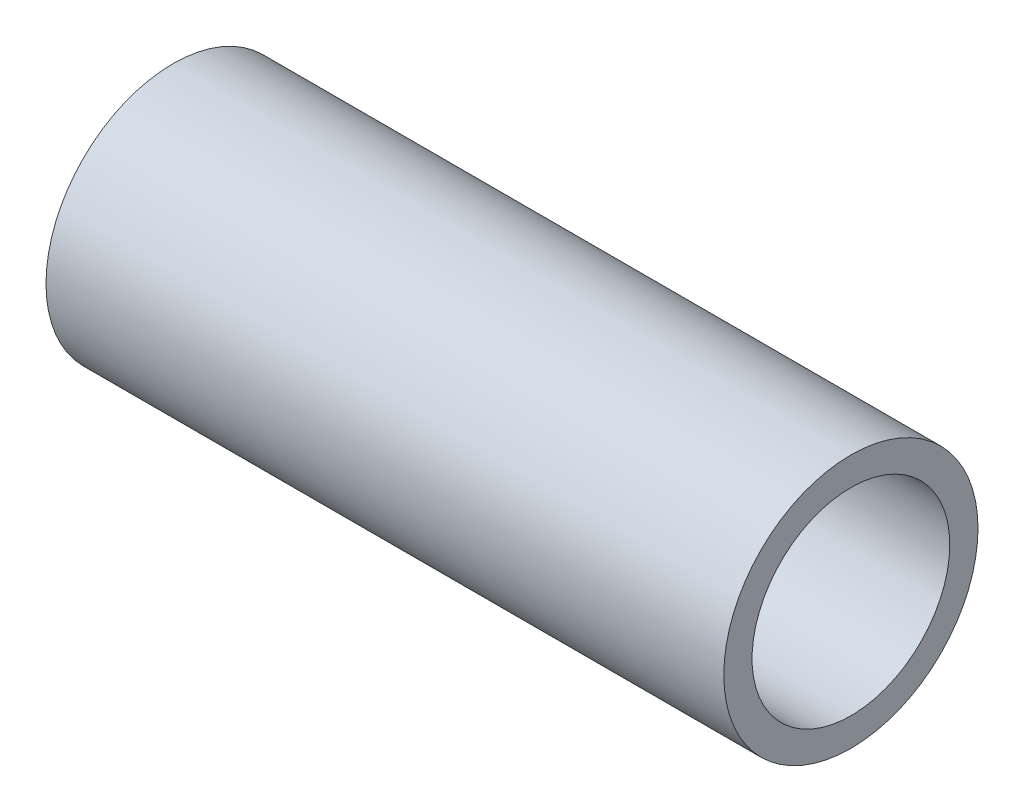
ISO-10303-21;
HEADER;
FILE_DESCRIPTION(('STEP AP214'),'2;1');
FILE_NAME('part.step','',(''),(''),'','','');
FILE_SCHEMA(('AUTOMOTIVE_DESIGN { 1 0 10303 214 1 1 1 1 }'));
ENDSEC;
DATA;
#1=APPLICATION_CONTEXT('core data for automotive mechanical design processes');
#2=APPLICATION_PROTOCOL_DEFINITION('international standard','automotive_design',2000,#1);
#3=PRODUCT_CONTEXT('',#1,'mechanical');
#4=PRODUCT('Part','Part','',(#3));
#5=PRODUCT_RELATED_PRODUCT_CATEGORY('part','',(#4));
#6=PRODUCT_DEFINITION_FORMATION('','',#4);
#7=PRODUCT_DEFINITION_CONTEXT('part definition',#1,'design');
#8=PRODUCT_DEFINITION('design','',#6,#7);
#9=PRODUCT_DEFINITION_SHAPE('','',#8);
#10=(LENGTH_UNIT() NAMED_UNIT(*) SI_UNIT(.MILLI.,.METRE.));
#11=(NAMED_UNIT(*) PLANE_ANGLE_UNIT() SI_UNIT($,.RADIAN.));
#12=(NAMED_UNIT(*) SI_UNIT($,.STERADIAN.) SOLID_ANGLE_UNIT());
#13=UNCERTAINTY_MEASURE_WITH_UNIT(LENGTH_MEASURE(1.E-05),#10,'distance_accuracy_value','');
#14=(GEOMETRIC_REPRESENTATION_CONTEXT(3) GLOBAL_UNCERTAINTY_ASSIGNED_CONTEXT((#13)) GLOBAL_UNIT_ASSIGNED_CONTEXT((#10,
#11,#12)) REPRESENTATION_CONTEXT('',''));
#15=CARTESIAN_POINT('',(0.,0.,0.));
#16=DIRECTION('',(0.,0.,1.));
#17=DIRECTION('',(1.,0.,0.));
#18=AXIS2_PLACEMENT_3D('',#15,#16,#17);
#19=CARTESIAN_POINT('',(24.,0.,0.));
#20=DIRECTION('',(1.,0.,0.));
#21=DIRECTION('',(0.,0.,-1.));
#22=AXIS2_PLACEMENT_3D('',#19,#20,#21);
#23=PLANE('',#22);
#24=CARTESIAN_POINT('',(24.,0.,0.));
#25=DIRECTION('',(1.,0.,0.));
#26=DIRECTION('',(0.,0.,-1.));
#27=AXIS2_PLACEMENT_3D('',#24,#25,#26);
#28=CIRCLE('',#27,9.);
#29=CARTESIAN_POINT('',(24.,0.,-9.));
#30=VERTEX_POINT('',#29);
#31=EDGE_CURVE('E10',#30,#30,#28,.T.);
#32=ORIENTED_EDGE('',*,*,#31,.T.);
#33=EDGE_LOOP('',(#32));
#34=FACE_BOUND('',#33,.T.);
#35=CARTESIAN_POINT('',(24.,0.,0.));
#36=DIRECTION('',(1.,0.,0.));
#37=DIRECTION('',(0.,0.,-1.));
#38=AXIS2_PLACEMENT_3D('',#35,#36,#37);
#39=CIRCLE('',#38,7.);
#40=CARTESIAN_POINT('',(24.,0.,-7.));
#41=VERTEX_POINT('',#40);
#42=EDGE_CURVE('E55',#41,#41,#39,.T.);
#43=ORIENTED_EDGE('',*,*,#42,.F.);
#44=EDGE_LOOP('',(#43));
#45=FACE_BOUND('',#44,.T.);
#46=ADVANCED_FACE('F40',(#34,#45),#23,.T.);
#47=CARTESIAN_POINT('',(-24.,0.,0.));
#48=DIRECTION('',(1.,0.,0.));
#49=DIRECTION('',(0.,0.,-1.));
#50=AXIS2_PLACEMENT_3D('',#47,#48,#49);
#51=PLANE('',#50);
#52=CARTESIAN_POINT('',(-24.,0.,0.));
#53=DIRECTION('',(1.,0.,0.));
#54=DIRECTION('',(0.,0.,-1.));
#55=AXIS2_PLACEMENT_3D('',#52,#53,#54);
#56=CIRCLE('',#55,9.);
#57=CARTESIAN_POINT('',(-24.,0.,-9.));
#58=VERTEX_POINT('',#57);
#59=EDGE_CURVE('E44',#58,#58,#56,.T.);
#60=ORIENTED_EDGE('',*,*,#59,.F.);
#61=EDGE_LOOP('',(#60));
#62=FACE_BOUND('',#61,.T.);
#63=CARTESIAN_POINT('',(-24.,0.,0.));
#64=DIRECTION('',(1.,0.,0.));
#65=DIRECTION('',(0.,0.,-1.));
#66=AXIS2_PLACEMENT_3D('',#63,#64,#65);
#67=CIRCLE('',#66,7.);
#68=CARTESIAN_POINT('',(-24.,0.,-7.));
#69=VERTEX_POINT('',#68);
#70=EDGE_CURVE('E57',#69,#69,#67,.T.);
#71=ORIENTED_EDGE('',*,*,#70,.T.);
#72=EDGE_LOOP('',(#71));
#73=FACE_BOUND('',#72,.T.);
#74=ADVANCED_FACE('F71',(#62,#73),#51,.F.);
#75=CARTESIAN_POINT('',(24.,0.,0.));
#76=DIRECTION('',(-1.,0.,0.));
#77=DIRECTION('',(0.,0.,1.));
#78=AXIS2_PLACEMENT_3D('',#75,#76,#77);
#79=CYLINDRICAL_SURFACE('',#78,9.);
#80=ORIENTED_EDGE('',*,*,#31,.F.);
#81=EDGE_LOOP('',(#80));
#82=FACE_BOUND('',#81,.T.);
#83=ORIENTED_EDGE('',*,*,#59,.T.);
#84=EDGE_LOOP('',(#83));
#85=FACE_BOUND('',#84,.T.);
#86=ADVANCED_FACE('F42',(#82,#85),#79,.T.);
#87=CARTESIAN_POINT('',(24.,0.,0.));
#88=DIRECTION('',(-1.,0.,0.));
#89=DIRECTION('',(0.,0.,1.));
#90=AXIS2_PLACEMENT_3D('',#87,#88,#89);
#91=CYLINDRICAL_SURFACE('',#90,7.);
#92=ORIENTED_EDGE('',*,*,#42,.T.);
#93=EDGE_LOOP('',(#92));
#94=FACE_BOUND('',#93,.T.);
#95=ORIENTED_EDGE('',*,*,#70,.F.);
#96=EDGE_LOOP('',(#95));
#97=FACE_BOUND('',#96,.T.);
#98=ADVANCED_FACE('F67',(#94,#97),#91,.F.);
#99=CLOSED_SHELL('',(#46,#74,#86,#98));
#100=MANIFOLD_SOLID_BREP('B2',#99);
#101=ADVANCED_BREP_SHAPE_REPRESENTATION('',(#18,#100),#14);
#102=SHAPE_DEFINITION_REPRESENTATION(#9,#101);
ENDSEC;
END-ISO-10303-21;
